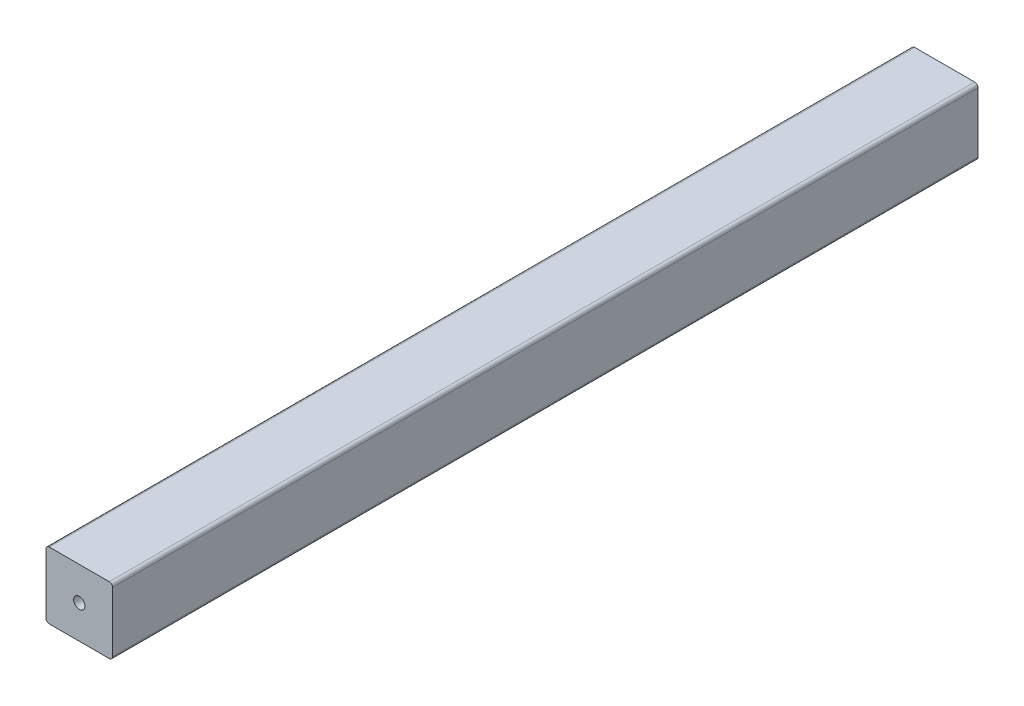
ISO-10303-21;
HEADER;
FILE_DESCRIPTION(('STEP AP214'),'2;1');
FILE_NAME('part.step','',(''),(''),'','','');
FILE_SCHEMA(('AUTOMOTIVE_DESIGN { 1 0 10303 214 1 1 1 1 }'));
ENDSEC;
DATA;
#1=APPLICATION_CONTEXT('core data for automotive mechanical design processes');
#2=APPLICATION_PROTOCOL_DEFINITION('international standard','automotive_design',2000,#1);
#3=PRODUCT_CONTEXT('',#1,'mechanical');
#4=PRODUCT('Part','Part','',(#3));
#5=PRODUCT_RELATED_PRODUCT_CATEGORY('part','',(#4));
#6=PRODUCT_DEFINITION_FORMATION('','',#4);
#7=PRODUCT_DEFINITION_CONTEXT('part definition',#1,'design');
#8=PRODUCT_DEFINITION('design','',#6,#7);
#9=PRODUCT_DEFINITION_SHAPE('','',#8);
#10=(LENGTH_UNIT() NAMED_UNIT(*) SI_UNIT(.MILLI.,.METRE.));
#11=(NAMED_UNIT(*) PLANE_ANGLE_UNIT() SI_UNIT($,.RADIAN.));
#12=(NAMED_UNIT(*) SI_UNIT($,.STERADIAN.) SOLID_ANGLE_UNIT());
#13=UNCERTAINTY_MEASURE_WITH_UNIT(LENGTH_MEASURE(1.E-05),#10,'distance_accuracy_value','');
#14=(GEOMETRIC_REPRESENTATION_CONTEXT(3) GLOBAL_UNCERTAINTY_ASSIGNED_CONTEXT((#13)) GLOBAL_UNIT_ASSIGNED_CONTEXT((#10,
#11,#12)) REPRESENTATION_CONTEXT('',''));
#15=CARTESIAN_POINT('',(0.,0.,0.));
#16=DIRECTION('',(0.,0.,1.));
#17=DIRECTION('',(1.,0.,0.));
#18=AXIS2_PLACEMENT_3D('',#15,#16,#17);
#19=CARTESIAN_POINT('',(0.,0.,260.));
#20=DIRECTION('',(0.,0.,-1.));
#21=DIRECTION('',(-1.,0.,0.));
#22=AXIS2_PLACEMENT_3D('',#19,#20,#21);
#23=PLANE('',#22);
#24=CARTESIAN_POINT('',(0.,0.,260.));
#25=DIRECTION('',(0.,0.,1.));
#26=DIRECTION('',(1.,0.,0.));
#27=AXIS2_PLACEMENT_3D('',#24,#25,#26);
#28=CIRCLE('',#27,3.39999999999999);
#29=CARTESIAN_POINT('',(3.39999999999999,0.,260.));
#30=VERTEX_POINT('',#29);
#31=EDGE_CURVE('E200',#30,#30,#28,.T.);
#32=ORIENTED_EDGE('',*,*,#31,.F.);
#33=EDGE_LOOP('',(#32));
#34=FACE_BOUND('',#33,.T.);
#35=DIRECTION('',(1.,0.,0.));
#36=VECTOR('',#35,1.);
#37=CARTESIAN_POINT('',(-20.,-20.,260.));
#38=LINE('',#37,#36);
#39=CARTESIAN_POINT('',(-18.,-20.,260.));
#40=VERTEX_POINT('',#39);
#41=CARTESIAN_POINT('',(18.,-20.,260.));
#42=VERTEX_POINT('',#41);
#43=EDGE_CURVE('E148',#40,#42,#38,.T.);
#44=ORIENTED_EDGE('',*,*,#43,.T.);
#45=CARTESIAN_POINT('',(18.,-18.,260.));
#46=DIRECTION('',(0.,0.,-1.));
#47=DIRECTION('',(-1.,0.,0.));
#48=AXIS2_PLACEMENT_3D('',#45,#46,#47);
#49=CIRCLE('',#48,2.);
#50=CARTESIAN_POINT('',(20.,-18.,260.));
#51=VERTEX_POINT('',#50);
#52=EDGE_CURVE('E169',#42,#51,#49,.F.);
#53=ORIENTED_EDGE('',*,*,#52,.T.);
#54=DIRECTION('',(0.,1.,0.));
#55=VECTOR('',#54,1.);
#56=CARTESIAN_POINT('',(20.,-20.,260.));
#57=LINE('',#56,#55);
#58=CARTESIAN_POINT('',(20.,18.,260.));
#59=VERTEX_POINT('',#58);
#60=EDGE_CURVE('E132',#51,#59,#57,.T.);
#61=ORIENTED_EDGE('',*,*,#60,.T.);
#62=CARTESIAN_POINT('',(18.,18.,260.));
#63=DIRECTION('',(0.,0.,-1.));
#64=DIRECTION('',(-1.,0.,0.));
#65=AXIS2_PLACEMENT_3D('',#62,#63,#64);
#66=CIRCLE('',#65,2.);
#67=CARTESIAN_POINT('',(18.,20.,260.));
#68=VERTEX_POINT('',#67);
#69=EDGE_CURVE('E165',#59,#68,#66,.F.);
#70=ORIENTED_EDGE('',*,*,#69,.T.);
#71=DIRECTION('',(-1.,0.,0.));
#72=VECTOR('',#71,1.);
#73=CARTESIAN_POINT('',(-20.,20.,260.));
#74=LINE('',#73,#72);
#75=CARTESIAN_POINT('',(-18.,20.,260.));
#76=VERTEX_POINT('',#75);
#77=EDGE_CURVE('E181',#68,#76,#74,.T.);
#78=ORIENTED_EDGE('',*,*,#77,.T.);
#79=CARTESIAN_POINT('',(-18.,18.,260.));
#80=DIRECTION('',(0.,0.,-1.));
#81=DIRECTION('',(-1.,0.,0.));
#82=AXIS2_PLACEMENT_3D('',#79,#80,#81);
#83=CIRCLE('',#82,2.);
#84=CARTESIAN_POINT('',(-20.,18.,260.));
#85=VERTEX_POINT('',#84);
#86=EDGE_CURVE('E71',#76,#85,#83,.F.);
#87=ORIENTED_EDGE('',*,*,#86,.T.);
#88=DIRECTION('',(0.,-1.,0.));
#89=VECTOR('',#88,1.);
#90=CARTESIAN_POINT('',(-20.,-20.,260.));
#91=LINE('',#90,#89);
#92=CARTESIAN_POINT('',(-20.,-18.,260.));
#93=VERTEX_POINT('',#92);
#94=EDGE_CURVE('E186',#85,#93,#91,.T.);
#95=ORIENTED_EDGE('',*,*,#94,.T.);
#96=CARTESIAN_POINT('',(-18.,-18.,260.));
#97=DIRECTION('',(0.,0.,-1.));
#98=DIRECTION('',(-1.,0.,0.));
#99=AXIS2_PLACEMENT_3D('',#96,#97,#98);
#100=CIRCLE('',#99,2.);
#101=EDGE_CURVE('E170',#93,#40,#100,.F.);
#102=ORIENTED_EDGE('',*,*,#101,.T.);
#103=EDGE_LOOP('',(#44,#53,#61,#70,#78,#87,#95,#102));
#104=FACE_BOUND('',#103,.T.);
#105=ADVANCED_FACE('F50',(#34,#104),#23,.F.);
#106=CARTESIAN_POINT('',(0.,0.,-260.));
#107=DIRECTION('',(0.,0.,-1.));
#108=DIRECTION('',(-1.,0.,0.));
#109=AXIS2_PLACEMENT_3D('',#106,#107,#108);
#110=PLANE('',#109);
#111=CARTESIAN_POINT('',(0.,0.,-260.));
#112=DIRECTION('',(0.,0.,-1.));
#113=DIRECTION('',(-1.,0.,0.));
#114=AXIS2_PLACEMENT_3D('',#111,#112,#113);
#115=CIRCLE('',#114,3.39999999999999);
#116=CARTESIAN_POINT('',(-3.39999999999999,0.,-260.));
#117=VERTEX_POINT('',#116);
#118=EDGE_CURVE('E202',#117,#117,#115,.T.);
#119=ORIENTED_EDGE('',*,*,#118,.F.);
#120=EDGE_LOOP('',(#119));
#121=FACE_BOUND('',#120,.T.);
#122=DIRECTION('',(0.,1.,0.));
#123=VECTOR('',#122,1.);
#124=CARTESIAN_POINT('',(20.,-20.,-260.));
#125=LINE('',#124,#123);
#126=CARTESIAN_POINT('',(20.,-18.,-260.));
#127=VERTEX_POINT('',#126);
#128=CARTESIAN_POINT('',(20.,18.,-260.));
#129=VERTEX_POINT('',#128);
#130=EDGE_CURVE('E135',#127,#129,#125,.T.);
#131=ORIENTED_EDGE('',*,*,#130,.F.);
#132=CARTESIAN_POINT('',(18.,-18.,-260.));
#133=DIRECTION('',(0.,0.,-1.));
#134=DIRECTION('',(-1.,0.,0.));
#135=AXIS2_PLACEMENT_3D('',#132,#133,#134);
#136=CIRCLE('',#135,2.);
#137=CARTESIAN_POINT('',(18.,-20.,-260.));
#138=VERTEX_POINT('',#137);
#139=EDGE_CURVE('E114',#127,#138,#136,.T.);
#140=ORIENTED_EDGE('',*,*,#139,.T.);
#141=DIRECTION('',(1.,0.,0.));
#142=VECTOR('',#141,1.);
#143=CARTESIAN_POINT('',(-20.,-20.,-260.));
#144=LINE('',#143,#142);
#145=CARTESIAN_POINT('',(-18.,-20.,-260.));
#146=VERTEX_POINT('',#145);
#147=EDGE_CURVE('E154',#146,#138,#144,.T.);
#148=ORIENTED_EDGE('',*,*,#147,.F.);
#149=CARTESIAN_POINT('',(-18.,-18.,-260.));
#150=DIRECTION('',(0.,0.,-1.));
#151=DIRECTION('',(-1.,0.,0.));
#152=AXIS2_PLACEMENT_3D('',#149,#150,#151);
#153=CIRCLE('',#152,2.);
#154=CARTESIAN_POINT('',(-20.,-18.,-260.));
#155=VERTEX_POINT('',#154);
#156=EDGE_CURVE('E127',#146,#155,#153,.T.);
#157=ORIENTED_EDGE('',*,*,#156,.T.);
#158=DIRECTION('',(0.,-1.,0.));
#159=VECTOR('',#158,1.);
#160=CARTESIAN_POINT('',(-20.,-20.,-260.));
#161=LINE('',#160,#159);
#162=CARTESIAN_POINT('',(-20.,18.,-260.));
#163=VERTEX_POINT('',#162);
#164=EDGE_CURVE('E143',#163,#155,#161,.T.);
#165=ORIENTED_EDGE('',*,*,#164,.F.);
#166=CARTESIAN_POINT('',(-18.,18.,-260.));
#167=DIRECTION('',(0.,0.,-1.));
#168=DIRECTION('',(-1.,0.,0.));
#169=AXIS2_PLACEMENT_3D('',#166,#167,#168);
#170=CIRCLE('',#169,2.);
#171=CARTESIAN_POINT('',(-18.,20.,-260.));
#172=VERTEX_POINT('',#171);
#173=EDGE_CURVE('E157',#163,#172,#170,.T.);
#174=ORIENTED_EDGE('',*,*,#173,.T.);
#175=DIRECTION('',(-1.,0.,0.));
#176=VECTOR('',#175,1.);
#177=CARTESIAN_POINT('',(-20.,20.,-260.));
#178=LINE('',#177,#176);
#179=CARTESIAN_POINT('',(18.,20.,-260.));
#180=VERTEX_POINT('',#179);
#181=EDGE_CURVE('E142',#180,#172,#178,.T.);
#182=ORIENTED_EDGE('',*,*,#181,.F.);
#183=CARTESIAN_POINT('',(18.,18.,-260.));
#184=DIRECTION('',(0.,0.,-1.));
#185=DIRECTION('',(-1.,0.,0.));
#186=AXIS2_PLACEMENT_3D('',#183,#184,#185);
#187=CIRCLE('',#186,2.);
#188=EDGE_CURVE('E136',#180,#129,#187,.T.);
#189=ORIENTED_EDGE('',*,*,#188,.T.);
#190=EDGE_LOOP('',(#131,#140,#148,#157,#165,#174,#182,#189));
#191=FACE_BOUND('',#190,.T.);
#192=ADVANCED_FACE('F138',(#121,#191),#110,.T.);
#193=CARTESIAN_POINT('',(20.,-20.,260.));
#194=DIRECTION('',(-1.,0.,0.));
#195=DIRECTION('',(0.,0.,1.));
#196=AXIS2_PLACEMENT_3D('',#193,#194,#195);
#197=PLANE('',#196);
#198=ORIENTED_EDGE('',*,*,#60,.F.);
#199=DIRECTION('',(0.,0.,-1.));
#200=VECTOR('',#199,1.);
#201=CARTESIAN_POINT('',(20.,-18.,260.));
#202=LINE('',#201,#200);
#203=EDGE_CURVE('E118',#51,#127,#202,.T.);
#204=ORIENTED_EDGE('',*,*,#203,.T.);
#205=ORIENTED_EDGE('',*,*,#130,.T.);
#206=DIRECTION('',(0.,0.,-1.));
#207=VECTOR('',#206,1.);
#208=CARTESIAN_POINT('',(20.,18.,260.));
#209=LINE('',#208,#207);
#210=EDGE_CURVE('E140',#129,#59,#209,.F.);
#211=ORIENTED_EDGE('',*,*,#210,.T.);
#212=EDGE_LOOP('',(#198,#204,#205,#211));
#213=FACE_BOUND('',#212,.T.);
#214=ADVANCED_FACE('F133',(#213),#197,.F.);
#215=CARTESIAN_POINT('',(-20.,20.,260.));
#216=DIRECTION('',(0.,-1.,0.));
#217=DIRECTION('',(0.,0.,-1.));
#218=AXIS2_PLACEMENT_3D('',#215,#216,#217);
#219=PLANE('',#218);
#220=ORIENTED_EDGE('',*,*,#181,.T.);
#221=DIRECTION('',(0.,0.,-1.));
#222=VECTOR('',#221,1.);
#223=CARTESIAN_POINT('',(-18.,20.,260.));
#224=LINE('',#223,#222);
#225=EDGE_CURVE('E11',#172,#76,#224,.F.);
#226=ORIENTED_EDGE('',*,*,#225,.T.);
#227=ORIENTED_EDGE('',*,*,#77,.F.);
#228=DIRECTION('',(0.,0.,-1.));
#229=VECTOR('',#228,1.);
#230=CARTESIAN_POINT('',(18.,20.,260.));
#231=LINE('',#230,#229);
#232=EDGE_CURVE('E57',#68,#180,#231,.T.);
#233=ORIENTED_EDGE('',*,*,#232,.T.);
#234=EDGE_LOOP('',(#220,#226,#227,#233));
#235=FACE_BOUND('',#234,.T.);
#236=ADVANCED_FACE('F177',(#235),#219,.F.);
#237=CARTESIAN_POINT('',(-20.,-20.,260.));
#238=DIRECTION('',(1.,0.,0.));
#239=DIRECTION('',(0.,0.,-1.));
#240=AXIS2_PLACEMENT_3D('',#237,#238,#239);
#241=PLANE('',#240);
#242=ORIENTED_EDGE('',*,*,#164,.T.);
#243=DIRECTION('',(0.,0.,-1.));
#244=VECTOR('',#243,1.);
#245=CARTESIAN_POINT('',(-20.,-18.,260.));
#246=LINE('',#245,#244);
#247=EDGE_CURVE('E61',#155,#93,#246,.F.);
#248=ORIENTED_EDGE('',*,*,#247,.T.);
#249=ORIENTED_EDGE('',*,*,#94,.F.);
#250=DIRECTION('',(0.,0.,-1.));
#251=VECTOR('',#250,1.);
#252=CARTESIAN_POINT('',(-20.,18.,260.));
#253=LINE('',#252,#251);
#254=EDGE_CURVE('E171',#85,#163,#253,.T.);
#255=ORIENTED_EDGE('',*,*,#254,.T.);
#256=EDGE_LOOP('',(#242,#248,#249,#255));
#257=FACE_BOUND('',#256,.T.);
#258=ADVANCED_FACE('F189',(#257),#241,.F.);
#259=CARTESIAN_POINT('',(-20.,-20.,260.));
#260=DIRECTION('',(0.,1.,0.));
#261=DIRECTION('',(0.,0.,1.));
#262=AXIS2_PLACEMENT_3D('',#259,#260,#261);
#263=PLANE('',#262);
#264=ORIENTED_EDGE('',*,*,#147,.T.);
#265=DIRECTION('',(0.,0.,-1.));
#266=VECTOR('',#265,1.);
#267=CARTESIAN_POINT('',(18.,-20.,260.));
#268=LINE('',#267,#266);
#269=EDGE_CURVE('E119',#138,#42,#268,.F.);
#270=ORIENTED_EDGE('',*,*,#269,.T.);
#271=ORIENTED_EDGE('',*,*,#43,.F.);
#272=DIRECTION('',(0.,0.,-1.));
#273=VECTOR('',#272,1.);
#274=CARTESIAN_POINT('',(-18.,-20.,260.));
#275=LINE('',#274,#273);
#276=EDGE_CURVE('E123',#40,#146,#275,.T.);
#277=ORIENTED_EDGE('',*,*,#276,.T.);
#278=EDGE_LOOP('',(#264,#270,#271,#277));
#279=FACE_BOUND('',#278,.T.);
#280=ADVANCED_FACE('F221',(#279),#263,.F.);
#281=CARTESIAN_POINT('',(0.,0.,260.));
#282=DIRECTION('',(0.,0.,-1.));
#283=DIRECTION('',(-1.,0.,0.));
#284=AXIS2_PLACEMENT_3D('',#281,#282,#283);
#285=CYLINDRICAL_SURFACE('',#284,2.5);
#286=CARTESIAN_POINT('',(0.,0.,-231.709225442875));
#287=DIRECTION('',(0.,0.,-1.));
#288=DIRECTION('',(-1.,0.,0.));
#289=AXIS2_PLACEMENT_3D('',#286,#287,#288);
#290=CIRCLE('',#289,2.5);
#291=CARTESIAN_POINT('',(-2.5,0.,-231.709225442875));
#292=VERTEX_POINT('',#291);
#293=EDGE_CURVE('E51',#292,#292,#290,.F.);
#294=ORIENTED_EDGE('',*,*,#293,.F.);
#295=EDGE_LOOP('',(#294));
#296=FACE_BOUND('',#295,.T.);
#297=CARTESIAN_POINT('',(0.,0.,231.709225442875));
#298=DIRECTION('',(0.,0.,1.));
#299=DIRECTION('',(1.,0.,0.));
#300=AXIS2_PLACEMENT_3D('',#297,#298,#299);
#301=CIRCLE('',#300,2.5);
#302=CARTESIAN_POINT('',(2.5,0.,231.709225442875));
#303=VERTEX_POINT('',#302);
#304=EDGE_CURVE('E145',#303,#303,#301,.F.);
#305=ORIENTED_EDGE('',*,*,#304,.F.);
#306=EDGE_LOOP('',(#305));
#307=FACE_BOUND('',#306,.T.);
#308=ADVANCED_FACE('F223',(#296,#307),#285,.F.);
#309=CARTESIAN_POINT('',(18.,-18.,260.));
#310=DIRECTION('',(0.,0.,-1.));
#311=DIRECTION('',(-1.,0.,0.));
#312=AXIS2_PLACEMENT_3D('',#309,#310,#311);
#313=CYLINDRICAL_SURFACE('',#312,2.);
#314=ORIENTED_EDGE('',*,*,#52,.F.);
#315=ORIENTED_EDGE('',*,*,#269,.F.);
#316=ORIENTED_EDGE('',*,*,#139,.F.);
#317=ORIENTED_EDGE('',*,*,#203,.F.);
#318=EDGE_LOOP('',(#314,#315,#316,#317));
#319=FACE_BOUND('',#318,.T.);
#320=ADVANCED_FACE('F117',(#319),#313,.T.);
#321=CARTESIAN_POINT('',(-18.,-18.,260.));
#322=DIRECTION('',(0.,0.,-1.));
#323=DIRECTION('',(-1.,0.,0.));
#324=AXIS2_PLACEMENT_3D('',#321,#322,#323);
#325=CYLINDRICAL_SURFACE('',#324,2.);
#326=ORIENTED_EDGE('',*,*,#101,.F.);
#327=ORIENTED_EDGE('',*,*,#247,.F.);
#328=ORIENTED_EDGE('',*,*,#156,.F.);
#329=ORIENTED_EDGE('',*,*,#276,.F.);
#330=EDGE_LOOP('',(#326,#327,#328,#329));
#331=FACE_BOUND('',#330,.T.);
#332=ADVANCED_FACE('F235',(#331),#325,.T.);
#333=CARTESIAN_POINT('',(-18.,18.,260.));
#334=DIRECTION('',(0.,0.,-1.));
#335=DIRECTION('',(-1.,0.,0.));
#336=AXIS2_PLACEMENT_3D('',#333,#334,#335);
#337=CYLINDRICAL_SURFACE('',#336,2.);
#338=ORIENTED_EDGE('',*,*,#86,.F.);
#339=ORIENTED_EDGE('',*,*,#225,.F.);
#340=ORIENTED_EDGE('',*,*,#173,.F.);
#341=ORIENTED_EDGE('',*,*,#254,.F.);
#342=EDGE_LOOP('',(#338,#339,#340,#341));
#343=FACE_BOUND('',#342,.T.);
#344=ADVANCED_FACE('F190',(#343),#337,.T.);
#345=CARTESIAN_POINT('',(18.,18.,260.));
#346=DIRECTION('',(0.,0.,-1.));
#347=DIRECTION('',(-1.,0.,0.));
#348=AXIS2_PLACEMENT_3D('',#345,#346,#347);
#349=CYLINDRICAL_SURFACE('',#348,2.);
#350=ORIENTED_EDGE('',*,*,#69,.F.);
#351=ORIENTED_EDGE('',*,*,#210,.F.);
#352=ORIENTED_EDGE('',*,*,#188,.F.);
#353=ORIENTED_EDGE('',*,*,#232,.F.);
#354=EDGE_LOOP('',(#350,#351,#352,#353));
#355=FACE_BOUND('',#354,.T.);
#356=ADVANCED_FACE('F47',(#355),#349,.T.);
#357=CARTESIAN_POINT('',(0.,0.,232.25));
#358=DIRECTION('',(0.,0.,1.));
#359=DIRECTION('',(1.,0.,0.));
#360=AXIS2_PLACEMENT_3D('',#357,#358,#359);
#361=CONICAL_SURFACE('',#360,3.3999999999997,1.02974425867665);
#362=ORIENTED_EDGE('',*,*,#304,.T.);
#363=EDGE_LOOP('',(#362));
#364=FACE_BOUND('',#363,.T.);
#365=CARTESIAN_POINT('',(0.,0.,232.25));
#366=DIRECTION('',(0.,0.,1.));
#367=DIRECTION('',(1.,0.,0.));
#368=AXIS2_PLACEMENT_3D('',#365,#366,#367);
#369=CIRCLE('',#368,3.3999999999997);
#370=CARTESIAN_POINT('',(3.3999999999997,0.,232.25));
#371=VERTEX_POINT('',#370);
#372=EDGE_CURVE('E149',#371,#371,#369,.T.);
#373=ORIENTED_EDGE('',*,*,#372,.T.);
#374=EDGE_LOOP('',(#373));
#375=FACE_BOUND('',#374,.T.);
#376=ADVANCED_FACE('F237',(#364,#375),#361,.F.);
#377=CARTESIAN_POINT('',(0.,0.,260.));
#378=DIRECTION('',(0.,0.,1.));
#379=DIRECTION('',(1.,0.,0.));
#380=AXIS2_PLACEMENT_3D('',#377,#378,#379);
#381=CYLINDRICAL_SURFACE('',#380,3.39999999999985);
#382=ORIENTED_EDGE('',*,*,#372,.F.);
#383=EDGE_LOOP('',(#382));
#384=FACE_BOUND('',#383,.T.);
#385=ORIENTED_EDGE('',*,*,#31,.T.);
#386=EDGE_LOOP('',(#385));
#387=FACE_BOUND('',#386,.T.);
#388=ADVANCED_FACE('F242',(#384,#387),#381,.F.);
#389=CARTESIAN_POINT('',(0.,0.,-232.25));
#390=DIRECTION('',(0.,0.,-1.));
#391=DIRECTION('',(-1.,0.,0.));
#392=AXIS2_PLACEMENT_3D('',#389,#390,#391);
#393=CONICAL_SURFACE('',#392,3.3999999999997,1.02974425867665);
#394=ORIENTED_EDGE('',*,*,#293,.T.);
#395=EDGE_LOOP('',(#394));
#396=FACE_BOUND('',#395,.T.);
#397=CARTESIAN_POINT('',(0.,0.,-232.25));
#398=DIRECTION('',(0.,0.,-1.));
#399=DIRECTION('',(-1.,0.,0.));
#400=AXIS2_PLACEMENT_3D('',#397,#398,#399);
#401=CIRCLE('',#400,3.3999999999997);
#402=CARTESIAN_POINT('',(-3.3999999999997,0.,-232.25));
#403=VERTEX_POINT('',#402);
#404=EDGE_CURVE('E197',#403,#403,#401,.T.);
#405=ORIENTED_EDGE('',*,*,#404,.T.);
#406=EDGE_LOOP('',(#405));
#407=FACE_BOUND('',#406,.T.);
#408=ADVANCED_FACE('F254',(#396,#407),#393,.F.);
#409=CARTESIAN_POINT('',(0.,0.,-260.));
#410=DIRECTION('',(0.,0.,-1.));
#411=DIRECTION('',(-1.,0.,0.));
#412=AXIS2_PLACEMENT_3D('',#409,#410,#411);
#413=CYLINDRICAL_SURFACE('',#412,3.39999999999985);
#414=ORIENTED_EDGE('',*,*,#404,.F.);
#415=EDGE_LOOP('',(#414));
#416=FACE_BOUND('',#415,.T.);
#417=ORIENTED_EDGE('',*,*,#118,.T.);
#418=EDGE_LOOP('',(#417));
#419=FACE_BOUND('',#418,.T.);
#420=ADVANCED_FACE('F210',(#416,#419),#413,.F.);
#421=CLOSED_SHELL('',(#105,#192,#214,#236,#258,#280,#308,#320,#332,#344,#356,#376,#388,#408,#420));
#422=MANIFOLD_SOLID_BREP('B2',#421);
#423=ADVANCED_BREP_SHAPE_REPRESENTATION('',(#18,#422),#14);
#424=SHAPE_DEFINITION_REPRESENTATION(#9,#423);
ENDSEC;
END-ISO-10303-21;
